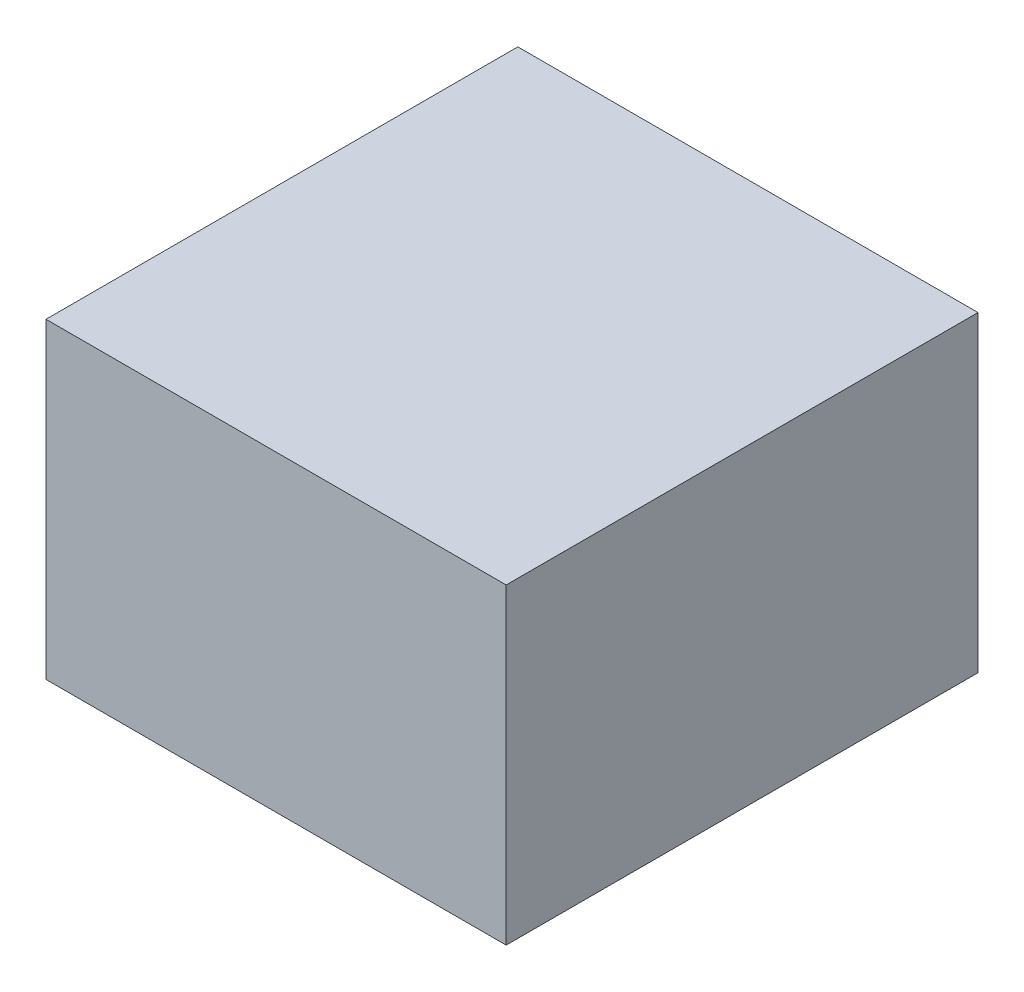
ISO-10303-21;
HEADER;
FILE_DESCRIPTION(('STEP AP214'),'2;1');
FILE_NAME('part.step','',(''),(''),'','','');
FILE_SCHEMA(('AUTOMOTIVE_DESIGN { 1 0 10303 214 1 1 1 1 }'));
ENDSEC;
DATA;
#1=APPLICATION_CONTEXT('core data for automotive mechanical design processes');
#2=APPLICATION_PROTOCOL_DEFINITION('international standard','automotive_design',2000,#1);
#3=PRODUCT_CONTEXT('',#1,'mechanical');
#4=PRODUCT('Part','Part','',(#3));
#5=PRODUCT_RELATED_PRODUCT_CATEGORY('part','',(#4));
#6=PRODUCT_DEFINITION_FORMATION('','',#4);
#7=PRODUCT_DEFINITION_CONTEXT('part definition',#1,'design');
#8=PRODUCT_DEFINITION('design','',#6,#7);
#9=PRODUCT_DEFINITION_SHAPE('','',#8);
#10=(LENGTH_UNIT() NAMED_UNIT(*) SI_UNIT(.MILLI.,.METRE.));
#11=(NAMED_UNIT(*) PLANE_ANGLE_UNIT() SI_UNIT($,.RADIAN.));
#12=(NAMED_UNIT(*) SI_UNIT($,.STERADIAN.) SOLID_ANGLE_UNIT());
#13=UNCERTAINTY_MEASURE_WITH_UNIT(LENGTH_MEASURE(1.E-05),#10,'distance_accuracy_value','');
#14=(GEOMETRIC_REPRESENTATION_CONTEXT(3) GLOBAL_UNCERTAINTY_ASSIGNED_CONTEXT((#13)) GLOBAL_UNIT_ASSIGNED_CONTEXT((#10,
#11,#12)) REPRESENTATION_CONTEXT('',''));
#15=CARTESIAN_POINT('',(0.,0.,0.));
#16=DIRECTION('',(0.,0.,1.));
#17=DIRECTION('',(1.,0.,0.));
#18=AXIS2_PLACEMENT_3D('',#15,#16,#17);
#19=CARTESIAN_POINT('',(-78.6892210701848,53.34,-80.6777573427166));
#20=DIRECTION('',(1.,0.,0.));
#21=DIRECTION('',(0.,0.,-1.));
#22=AXIS2_PLACEMENT_3D('',#19,#20,#21);
#23=PLANE('',#22);
#24=DIRECTION('',(0.,0.,1.));
#25=VECTOR('',#24,1.);
#26=CARTESIAN_POINT('',(-78.6892210701848,-53.34,-80.6777573427166));
#27=LINE('',#26,#25);
#28=CARTESIAN_POINT('',(-78.6892210701848,-53.34,-80.6777573427166));
#29=VERTEX_POINT('',#28);
#30=CARTESIAN_POINT('',(-78.6892210701848,-53.34,80.6777573427166));
#31=VERTEX_POINT('',#30);
#32=EDGE_CURVE('E95',#29,#31,#27,.T.);
#33=ORIENTED_EDGE('',*,*,#32,.T.);
#34=DIRECTION('',(0.,-1.,0.));
#35=VECTOR('',#34,1.);
#36=CARTESIAN_POINT('',(-78.6892210701848,53.34,80.6777573427166));
#37=LINE('',#36,#35);
#38=CARTESIAN_POINT('',(-78.6892210701848,53.34,80.6777573427166));
#39=VERTEX_POINT('',#38);
#40=EDGE_CURVE('E11',#39,#31,#37,.T.);
#41=ORIENTED_EDGE('',*,*,#40,.F.);
#42=DIRECTION('',(0.,0.,1.));
#43=VECTOR('',#42,1.);
#44=CARTESIAN_POINT('',(-78.6892210701848,53.34,-80.6777573427166));
#45=LINE('',#44,#43);
#46=CARTESIAN_POINT('',(-78.6892210701848,53.34,-80.6777573427166));
#47=VERTEX_POINT('',#46);
#48=EDGE_CURVE('E83',#47,#39,#45,.T.);
#49=ORIENTED_EDGE('',*,*,#48,.F.);
#50=DIRECTION('',(0.,-1.,0.));
#51=VECTOR('',#50,1.);
#52=CARTESIAN_POINT('',(-78.6892210701848,53.34,-80.6777573427166));
#53=LINE('',#52,#51);
#54=EDGE_CURVE('E91',#47,#29,#53,.T.);
#55=ORIENTED_EDGE('',*,*,#54,.T.);
#56=EDGE_LOOP('',(#33,#41,#49,#55));
#57=FACE_BOUND('',#56,.T.);
#58=ADVANCED_FACE('F32',(#57),#23,.F.);
#59=CARTESIAN_POINT('',(-78.6892210701848,53.34,80.6777573427166));
#60=DIRECTION('',(0.,0.,-1.));
#61=DIRECTION('',(-1.,0.,0.));
#62=AXIS2_PLACEMENT_3D('',#59,#60,#61);
#63=PLANE('',#62);
#64=DIRECTION('',(1.,0.,0.));
#65=VECTOR('',#64,1.);
#66=CARTESIAN_POINT('',(-78.6892210701848,-53.34,80.6777573427166));
#67=LINE('',#66,#65);
#68=CARTESIAN_POINT('',(78.6892210701848,-53.34,80.6777573427166));
#69=VERTEX_POINT('',#68);
#70=EDGE_CURVE('E87',#31,#69,#67,.T.);
#71=ORIENTED_EDGE('',*,*,#70,.T.);
#72=DIRECTION('',(0.,-1.,0.));
#73=VECTOR('',#72,1.);
#74=CARTESIAN_POINT('',(78.6892210701848,53.34,80.6777573427166));
#75=LINE('',#74,#73);
#76=CARTESIAN_POINT('',(78.6892210701848,53.34,80.6777573427166));
#77=VERTEX_POINT('',#76);
#78=EDGE_CURVE('E40',#77,#69,#75,.T.);
#79=ORIENTED_EDGE('',*,*,#78,.F.);
#80=DIRECTION('',(1.,0.,0.));
#81=VECTOR('',#80,1.);
#82=CARTESIAN_POINT('',(-78.6892210701848,53.34,80.6777573427166));
#83=LINE('',#82,#81);
#84=EDGE_CURVE('E78',#39,#77,#83,.T.);
#85=ORIENTED_EDGE('',*,*,#84,.F.);
#86=ORIENTED_EDGE('',*,*,#40,.T.);
#87=EDGE_LOOP('',(#71,#79,#85,#86));
#88=FACE_BOUND('',#87,.T.);
#89=ADVANCED_FACE('F86',(#88),#63,.F.);
#90=CARTESIAN_POINT('',(78.6892210701848,53.34,-80.6777573427166));
#91=DIRECTION('',(-1.,0.,0.));
#92=DIRECTION('',(0.,0.,1.));
#93=AXIS2_PLACEMENT_3D('',#90,#91,#92);
#94=PLANE('',#93);
#95=DIRECTION('',(0.,0.,-1.));
#96=VECTOR('',#95,1.);
#97=CARTESIAN_POINT('',(78.6892210701848,-53.34,-80.6777573427166));
#98=LINE('',#97,#96);
#99=CARTESIAN_POINT('',(78.6892210701848,-53.34,-80.6777573427166));
#100=VERTEX_POINT('',#99);
#101=EDGE_CURVE('E65',#69,#100,#98,.T.);
#102=ORIENTED_EDGE('',*,*,#101,.T.);
#103=DIRECTION('',(0.,-1.,0.));
#104=VECTOR('',#103,1.);
#105=CARTESIAN_POINT('',(78.6892210701848,53.34,-80.6777573427166));
#106=LINE('',#105,#104);
#107=CARTESIAN_POINT('',(78.6892210701848,53.34,-80.6777573427166));
#108=VERTEX_POINT('',#107);
#109=EDGE_CURVE('E88',#108,#100,#106,.T.);
#110=ORIENTED_EDGE('',*,*,#109,.F.);
#111=DIRECTION('',(0.,0.,-1.));
#112=VECTOR('',#111,1.);
#113=CARTESIAN_POINT('',(78.6892210701848,53.34,-80.6777573427166));
#114=LINE('',#113,#112);
#115=EDGE_CURVE('E81',#77,#108,#114,.T.);
#116=ORIENTED_EDGE('',*,*,#115,.F.);
#117=ORIENTED_EDGE('',*,*,#78,.T.);
#118=EDGE_LOOP('',(#102,#110,#116,#117));
#119=FACE_BOUND('',#118,.T.);
#120=ADVANCED_FACE('F89',(#119),#94,.F.);
#121=CARTESIAN_POINT('',(-78.6892210701848,53.34,-80.6777573427166));
#122=DIRECTION('',(0.,0.,1.));
#123=DIRECTION('',(1.,0.,0.));
#124=AXIS2_PLACEMENT_3D('',#121,#122,#123);
#125=PLANE('',#124);
#126=DIRECTION('',(-1.,0.,0.));
#127=VECTOR('',#126,1.);
#128=CARTESIAN_POINT('',(-78.6892210701848,-53.34,-80.6777573427166));
#129=LINE('',#128,#127);
#130=EDGE_CURVE('E71',#100,#29,#129,.T.);
#131=ORIENTED_EDGE('',*,*,#130,.T.);
#132=ORIENTED_EDGE('',*,*,#54,.F.);
#133=DIRECTION('',(-1.,0.,0.));
#134=VECTOR('',#133,1.);
#135=CARTESIAN_POINT('',(-78.6892210701848,53.34,-80.6777573427166));
#136=LINE('',#135,#134);
#137=EDGE_CURVE('E48',#108,#47,#136,.T.);
#138=ORIENTED_EDGE('',*,*,#137,.F.);
#139=ORIENTED_EDGE('',*,*,#109,.T.);
#140=EDGE_LOOP('',(#131,#132,#138,#139));
#141=FACE_BOUND('',#140,.T.);
#142=ADVANCED_FACE('F102',(#141),#125,.F.);
#143=CARTESIAN_POINT('',(0.,53.34,0.));
#144=DIRECTION('',(0.,1.,0.));
#145=DIRECTION('',(0.,0.,1.));
#146=AXIS2_PLACEMENT_3D('',#143,#144,#145);
#147=PLANE('',#146);
#148=ORIENTED_EDGE('',*,*,#48,.T.);
#149=ORIENTED_EDGE('',*,*,#84,.T.);
#150=ORIENTED_EDGE('',*,*,#115,.T.);
#151=ORIENTED_EDGE('',*,*,#137,.T.);
#152=EDGE_LOOP('',(#148,#149,#150,#151));
#153=FACE_BOUND('',#152,.T.);
#154=ADVANCED_FACE('F79',(#153),#147,.T.);
#155=CARTESIAN_POINT('',(0.,-53.34,0.));
#156=DIRECTION('',(0.,1.,0.));
#157=DIRECTION('',(0.,0.,1.));
#158=AXIS2_PLACEMENT_3D('',#155,#156,#157);
#159=PLANE('',#158);
#160=ORIENTED_EDGE('',*,*,#32,.F.);
#161=ORIENTED_EDGE('',*,*,#130,.F.);
#162=ORIENTED_EDGE('',*,*,#101,.F.);
#163=ORIENTED_EDGE('',*,*,#70,.F.);
#164=EDGE_LOOP('',(#160,#161,#162,#163));
#165=FACE_BOUND('',#164,.T.);
#166=ADVANCED_FACE('F105',(#165),#159,.F.);
#167=CLOSED_SHELL('',(#58,#89,#120,#142,#154,#166));
#168=MANIFOLD_SOLID_BREP('B2',#167);
#169=ADVANCED_BREP_SHAPE_REPRESENTATION('',(#18,#168),#14);
#170=SHAPE_DEFINITION_REPRESENTATION(#9,#169);
ENDSEC;
END-ISO-10303-21;
